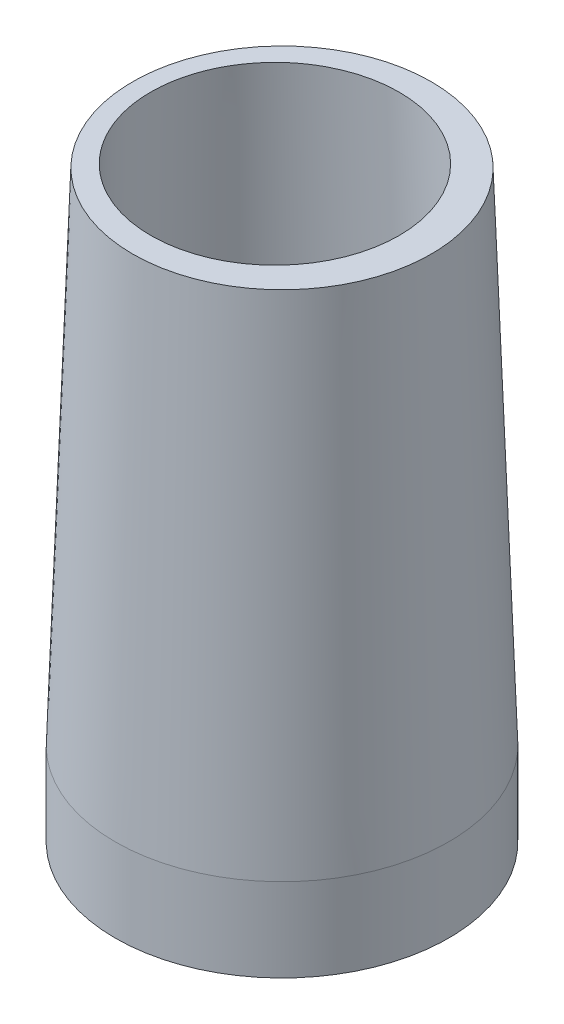
ISO-10303-21;
HEADER;
FILE_DESCRIPTION(('STEP AP214'),'2;1');
FILE_NAME('part.step','',(''),(''),'','','');
FILE_SCHEMA(('AUTOMOTIVE_DESIGN { 1 0 10303 214 1 1 1 1 }'));
ENDSEC;
DATA;
#1=APPLICATION_CONTEXT('core data for automotive mechanical design processes');
#2=APPLICATION_PROTOCOL_DEFINITION('international standard','automotive_design',2000,#1);
#3=PRODUCT_CONTEXT('',#1,'mechanical');
#4=PRODUCT('Part','Part','',(#3));
#5=PRODUCT_RELATED_PRODUCT_CATEGORY('part','',(#4));
#6=PRODUCT_DEFINITION_FORMATION('','',#4);
#7=PRODUCT_DEFINITION_CONTEXT('part definition',#1,'design');
#8=PRODUCT_DEFINITION('design','',#6,#7);
#9=PRODUCT_DEFINITION_SHAPE('','',#8);
#10=(LENGTH_UNIT() NAMED_UNIT(*) SI_UNIT(.MILLI.,.METRE.));
#11=(NAMED_UNIT(*) PLANE_ANGLE_UNIT() SI_UNIT($,.RADIAN.));
#12=(NAMED_UNIT(*) SI_UNIT($,.STERADIAN.) SOLID_ANGLE_UNIT());
#13=UNCERTAINTY_MEASURE_WITH_UNIT(LENGTH_MEASURE(1.E-05),#10,'distance_accuracy_value','');
#14=(GEOMETRIC_REPRESENTATION_CONTEXT(3) GLOBAL_UNCERTAINTY_ASSIGNED_CONTEXT((#13)) GLOBAL_UNIT_ASSIGNED_CONTEXT((#10,
#11,#12)) REPRESENTATION_CONTEXT('',''));
#15=CARTESIAN_POINT('',(0.,0.,0.));
#16=DIRECTION('',(0.,0.,1.));
#17=DIRECTION('',(1.,0.,0.));
#18=AXIS2_PLACEMENT_3D('',#15,#16,#17);
#19=CARTESIAN_POINT('',(0.,-10.,0.));
#20=DIRECTION('',(0.,1.,0.));
#21=DIRECTION('',(0.,0.,1.));
#22=AXIS2_PLACEMENT_3D('',#19,#20,#21);
#23=CYLINDRICAL_SURFACE('',#22,20.);
#24=CARTESIAN_POINT('',(0.,-10.,0.));
#25=DIRECTION('',(0.,1.,0.));
#26=DIRECTION('',(0.,0.,1.));
#27=AXIS2_PLACEMENT_3D('',#24,#25,#26);
#28=CIRCLE('',#27,20.);
#29=CARTESIAN_POINT('',(0.,-10.,20.));
#30=VERTEX_POINT('',#29);
#31=EDGE_CURVE('E11',#30,#30,#28,.T.);
#32=ORIENTED_EDGE('',*,*,#31,.T.);
#33=EDGE_LOOP('',(#32));
#34=FACE_BOUND('',#33,.T.);
#35=CARTESIAN_POINT('',(0.,0.,0.));
#36=DIRECTION('',(0.,1.,0.));
#37=DIRECTION('',(0.,0.,1.));
#38=AXIS2_PLACEMENT_3D('',#35,#36,#37);
#39=CIRCLE('',#38,20.);
#40=CARTESIAN_POINT('',(0.,0.,20.));
#41=VERTEX_POINT('',#40);
#42=EDGE_CURVE('E41',#41,#41,#39,.T.);
#43=ORIENTED_EDGE('',*,*,#42,.F.);
#44=EDGE_LOOP('',(#43));
#45=FACE_BOUND('',#44,.T.);
#46=ADVANCED_FACE('F34',(#34,#45),#23,.T.);
#47=CARTESIAN_POINT('',(0.,-10.,0.));
#48=DIRECTION('',(0.,1.,0.));
#49=DIRECTION('',(0.,0.,1.));
#50=AXIS2_PLACEMENT_3D('',#47,#48,#49);
#51=PLANE('',#50);
#52=ORIENTED_EDGE('',*,*,#31,.F.);
#53=EDGE_LOOP('',(#52));
#54=FACE_BOUND('',#53,.T.);
#55=ADVANCED_FACE('F70',(#54),#51,.F.);
#56=CARTESIAN_POINT('',(0.,0.,0.));
#57=DIRECTION('',(0.,-1.,0.));
#58=DIRECTION('',(0.,0.,1.));
#59=AXIS2_PLACEMENT_3D('',#56,#57,#58);
#60=CONICAL_SURFACE('',#59,20.,0.0349065850398867);
#61=CARTESIAN_POINT('',(0.,60.,0.));
#62=DIRECTION('',(0.,1.,0.));
#63=DIRECTION('',(0.,0.,1.));
#64=AXIS2_PLACEMENT_3D('',#61,#62,#63);
#65=CIRCLE('',#64,17.9047538304951);
#66=CARTESIAN_POINT('',(0.,60.,17.9047538304951));
#67=VERTEX_POINT('',#66);
#68=EDGE_CURVE('E62',#67,#67,#65,.T.);
#69=ORIENTED_EDGE('',*,*,#68,.F.);
#70=EDGE_LOOP('',(#69));
#71=FACE_BOUND('',#70,.T.);
#72=ORIENTED_EDGE('',*,*,#42,.T.);
#73=EDGE_LOOP('',(#72));
#74=FACE_BOUND('',#73,.T.);
#75=ADVANCED_FACE('F67',(#71,#74),#60,.T.);
#76=CARTESIAN_POINT('',(0.,60.,0.));
#77=DIRECTION('',(0.,1.,0.));
#78=DIRECTION('',(0.,0.,1.));
#79=AXIS2_PLACEMENT_3D('',#76,#77,#78);
#80=PLANE('',#79);
#81=CARTESIAN_POINT('',(-0.844978899390212,60.,0.));
#82=DIRECTION('',(0.,1.,0.));
#83=DIRECTION('',(1.,0.,0.));
#84=AXIS2_PLACEMENT_3D('',#81,#82,#83);
#85=ELLIPSE('',#84,14.898949358664,14.8974441122035);
#86=CARTESIAN_POINT('',(14.0539704592738,60.,0.));
#87=VERTEX_POINT('',#86);
#88=EDGE_CURVE('E37',#87,#87,#85,.F.);
#89=ORIENTED_EDGE('',*,*,#88,.T.);
#90=EDGE_LOOP('',(#89));
#91=FACE_BOUND('',#90,.T.);
#92=ORIENTED_EDGE('',*,*,#68,.T.);
#93=EDGE_LOOP('',(#92));
#94=FACE_BOUND('',#93,.T.);
#95=ADVANCED_FACE('F80',(#91,#94),#80,.T.);
#96=CARTESIAN_POINT('',(-0.855430740669295,60.2115222797321,0.));
#97=DIRECTION('',(0.0142056601566225,-0.999899094518799,0.));
#98=DIRECTION('',(0.999899094518799,0.0142056601566225,0.));
#99=AXIS2_PLACEMENT_3D('',#96,#97,#98);
#100=CONICAL_SURFACE('',#99,14.89,0.0351661898336645);
#101=ORIENTED_EDGE('',*,*,#88,.F.);
#102=EDGE_LOOP('',(#101));
#103=FACE_BOUND('',#102,.T.);
#104=CARTESIAN_POINT('',(-0.00343095947086251,0.241496222662584,0.));
#105=DIRECTION('',(0.0142056601566225,-0.999899094518799,0.));
#106=DIRECTION('',(0.999899094518799,0.0142056601566225,0.));
#107=AXIS2_PLACEMENT_3D('',#104,#105,#106);
#108=CIRCLE('',#107,17.);
#109=CARTESIAN_POINT('',(16.9948536473487,0.482992445325167,0.));
#110=VERTEX_POINT('',#109);
#111=EDGE_CURVE('E57',#110,#110,#108,.T.);
#112=ORIENTED_EDGE('',*,*,#111,.T.);
#113=EDGE_LOOP('',(#112));
#114=FACE_BOUND('',#113,.T.);
#115=ADVANCED_FACE('F86',(#103,#114),#100,.F.);
#116=CARTESIAN_POINT('',(-0.00343095947086251,0.241496222662584,0.));
#117=DIRECTION('',(0.0142056601566225,-0.999899094518799,0.));
#118=DIRECTION('',(0.999899094518799,0.0142056601566225,0.));
#119=AXIS2_PLACEMENT_3D('',#116,#117,#118);
#120=CONICAL_SURFACE('',#119,17.,0.0142061379855668);
#121=CARTESIAN_POINT('',(0.0964293353351077,-6.78740755611188,0.));
#122=DIRECTION('',(0.0142056601566225,-0.999899094518799,0.));
#123=DIRECTION('',(0.999899094518799,0.0142056601566225,0.));
#124=AXIS2_PLACEMENT_3D('',#121,#122,#123);
#125=CIRCLE('',#124,17.099870372274);
#126=CARTESIAN_POINT('',(17.1945742369607,-6.54449260888106,0.));
#127=VERTEX_POINT('',#126);
#128=EDGE_CURVE('E54',#127,#127,#125,.T.);
#129=ORIENTED_EDGE('',*,*,#128,.T.);
#130=EDGE_LOOP('',(#129));
#131=FACE_BOUND('',#130,.T.);
#132=ORIENTED_EDGE('',*,*,#111,.F.);
#133=EDGE_LOOP('',(#132));
#134=FACE_BOUND('',#133,.T.);
#135=ADVANCED_FACE('F90',(#131,#134),#120,.F.);
#136=CARTESIAN_POINT('',(0.0964293353351077,-6.78740755611188,0.));
#137=DIRECTION('',(-0.0142056601566225,0.999899094518799,0.));
#138=DIRECTION('',(-0.999899094518799,-0.0142056601566225,0.));
#139=AXIS2_PLACEMENT_3D('',#136,#137,#138);
#140=CONICAL_SURFACE('',#139,17.099870372274,1.55659018880933);
#141=CARTESIAN_POINT('',(0.0978622393054428,-6.88826590177648,0.));
#142=DIRECTION('',(0.0142056601566225,-0.999899094518799,0.));
#143=DIRECTION('',(0.999899094518799,0.0142056601566225,0.));
#144=AXIS2_PLACEMENT_3D('',#141,#142,#143);
#145=CIRCLE('',#144,10.);
#146=CARTESIAN_POINT('',(10.0968531844934,-6.74620930021025,0.));
#147=VERTEX_POINT('',#146);
#148=EDGE_CURVE('E52',#147,#147,#145,.T.);
#149=ORIENTED_EDGE('',*,*,#148,.T.);
#150=EDGE_LOOP('',(#149));
#151=FACE_BOUND('',#150,.T.);
#152=ORIENTED_EDGE('',*,*,#128,.F.);
#153=EDGE_LOOP('',(#152));
#154=FACE_BOUND('',#153,.T.);
#155=ADVANCED_FACE('F48',(#151,#154),#140,.F.);
#156=CARTESIAN_POINT('',(0.0978622393054428,-6.88826590177648,0.));
#157=DIRECTION('',(0.0142056601566225,-0.999899094518799,0.));
#158=DIRECTION('',(0.999899094518799,0.0142056601566225,0.));
#159=AXIS2_PLACEMENT_3D('',#156,#157,#158);
#160=CONICAL_SURFACE('',#159,10.,1.13121685926194);
#161=CARTESIAN_POINT('',(0.0310577227919887,-2.18607150636653,0.));
#162=VERTEX_POINT('',#161);
#163=VERTEX_LOOP('',#162);
#164=FACE_BOUND('',#163,.T.);
#165=ORIENTED_EDGE('',*,*,#148,.F.);
#166=EDGE_LOOP('',(#165));
#167=FACE_BOUND('',#166,.T.);
#168=ADVANCED_FACE('F45',(#164,#167),#160,.T.);
#169=CLOSED_SHELL('',(#46,#55,#75,#95,#115,#135,#155,#168));
#170=MANIFOLD_SOLID_BREP('B2',#169);
#171=ADVANCED_BREP_SHAPE_REPRESENTATION('',(#18,#170),#14);
#172=SHAPE_DEFINITION_REPRESENTATION(#9,#171);
ENDSEC;
END-ISO-10303-21;
